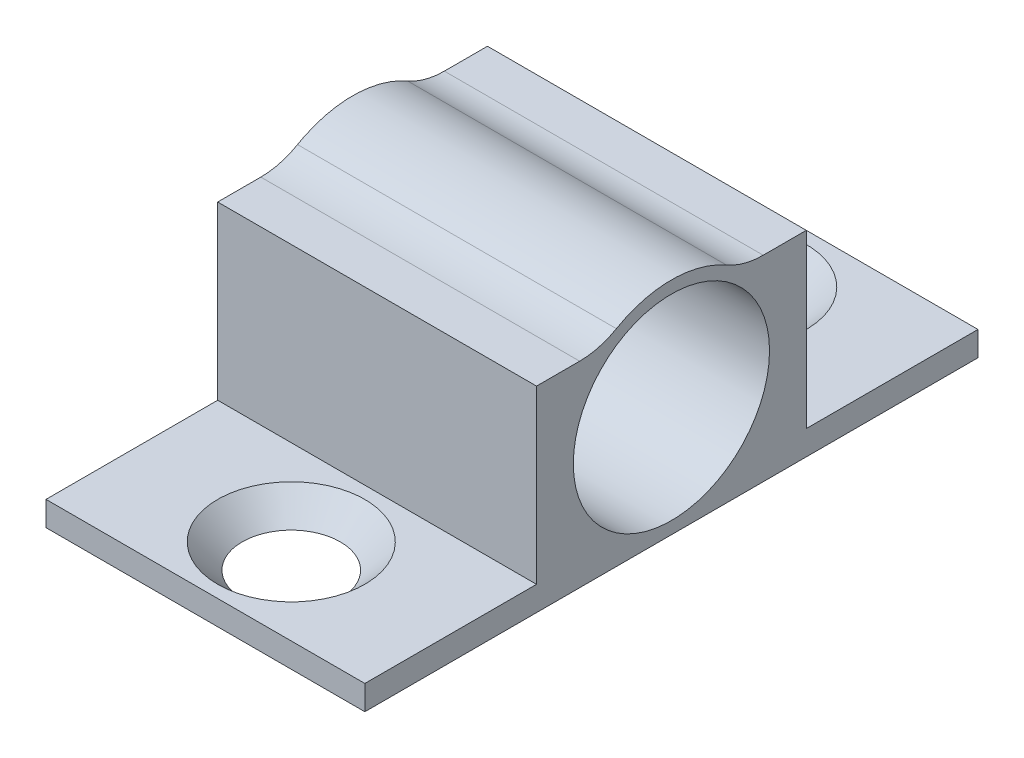
ISO-10303-21;
HEADER;
FILE_DESCRIPTION(('STEP AP214'),'2;1');
FILE_NAME('part.step','',(''),(''),'','','');
FILE_SCHEMA(('AUTOMOTIVE_DESIGN { 1 0 10303 214 1 1 1 1 }'));
ENDSEC;
DATA;
#1=APPLICATION_CONTEXT('core data for automotive mechanical design processes');
#2=APPLICATION_PROTOCOL_DEFINITION('international standard','automotive_design',2000,#1);
#3=PRODUCT_CONTEXT('',#1,'mechanical');
#4=PRODUCT('Part','Part','',(#3));
#5=PRODUCT_RELATED_PRODUCT_CATEGORY('part','',(#4));
#6=PRODUCT_DEFINITION_FORMATION('','',#4);
#7=PRODUCT_DEFINITION_CONTEXT('part definition',#1,'design');
#8=PRODUCT_DEFINITION('design','',#6,#7);
#9=PRODUCT_DEFINITION_SHAPE('','',#8);
#10=(LENGTH_UNIT() NAMED_UNIT(*) SI_UNIT(.MILLI.,.METRE.));
#11=(NAMED_UNIT(*) PLANE_ANGLE_UNIT() SI_UNIT($,.RADIAN.));
#12=(NAMED_UNIT(*) SI_UNIT($,.STERADIAN.) SOLID_ANGLE_UNIT());
#13=UNCERTAINTY_MEASURE_WITH_UNIT(LENGTH_MEASURE(1.E-05),#10,'distance_accuracy_value','');
#14=(GEOMETRIC_REPRESENTATION_CONTEXT(3) GLOBAL_UNCERTAINTY_ASSIGNED_CONTEXT((#13)) GLOBAL_UNIT_ASSIGNED_CONTEXT((#10,
#11,#12)) REPRESENTATION_CONTEXT('',''));
#15=CARTESIAN_POINT('',(0.,0.,0.));
#16=DIRECTION('',(0.,0.,1.));
#17=DIRECTION('',(1.,0.,0.));
#18=AXIS2_PLACEMENT_3D('',#15,#16,#17);
#19=CARTESIAN_POINT('',(0.,0.,0.));
#20=DIRECTION('',(0.,-1.,0.));
#21=DIRECTION('',(0.,0.,-1.));
#22=AXIS2_PLACEMENT_3D('',#19,#20,#21);
#23=PLANE('',#22);
#24=CARTESIAN_POINT('',(6.5,0.,-3.5));
#25=DIRECTION('',(0.,-1.,0.));
#26=DIRECTION('',(0.,0.,-1.));
#27=AXIS2_PLACEMENT_3D('',#24,#25,#26);
#28=CIRCLE('',#27,2.);
#29=CARTESIAN_POINT('',(6.5,0.,-5.5));
#30=VERTEX_POINT('',#29);
#31=EDGE_CURVE('E37',#30,#30,#28,.T.);
#32=ORIENTED_EDGE('',*,*,#31,.F.);
#33=EDGE_LOOP('',(#32));
#34=FACE_BOUND('',#33,.T.);
#35=DIRECTION('',(-1.,0.,0.));
#36=VECTOR('',#35,1.);
#37=CARTESIAN_POINT('',(0.,0.,-25.));
#38=LINE('',#37,#36);
#39=CARTESIAN_POINT('',(13.,0.,-25.));
#40=VERTEX_POINT('',#39);
#41=CARTESIAN_POINT('',(0.,0.,-25.));
#42=VERTEX_POINT('',#41);
#43=EDGE_CURVE('E194',#40,#42,#38,.T.);
#44=ORIENTED_EDGE('',*,*,#43,.F.);
#45=DIRECTION('',(0.,0.,-1.));
#46=VECTOR('',#45,1.);
#47=CARTESIAN_POINT('',(13.,0.,0.));
#48=LINE('',#47,#46);
#49=CARTESIAN_POINT('',(13.,0.,0.));
#50=VERTEX_POINT('',#49);
#51=EDGE_CURVE('E196',#50,#40,#48,.T.);
#52=ORIENTED_EDGE('',*,*,#51,.F.);
#53=DIRECTION('',(1.,0.,0.));
#54=VECTOR('',#53,1.);
#55=CARTESIAN_POINT('',(0.,0.,0.));
#56=LINE('',#55,#54);
#57=CARTESIAN_POINT('',(0.,0.,0.));
#58=VERTEX_POINT('',#57);
#59=EDGE_CURVE('E198',#58,#50,#56,.T.);
#60=ORIENTED_EDGE('',*,*,#59,.F.);
#61=DIRECTION('',(0.,0.,1.));
#62=VECTOR('',#61,1.);
#63=CARTESIAN_POINT('',(0.,0.,0.));
#64=LINE('',#63,#62);
#65=CARTESIAN_POINT('',(0.,0.,-12.5));
#66=VERTEX_POINT('',#65);
#67=EDGE_CURVE('E148',#66,#58,#64,.T.);
#68=ORIENTED_EDGE('',*,*,#67,.F.);
#69=EDGE_CURVE('E150',#42,#66,#64,.T.);
#70=ORIENTED_EDGE('',*,*,#69,.F.);
#71=EDGE_LOOP('',(#44,#52,#60,#68,#70));
#72=FACE_BOUND('',#71,.T.);
#73=CARTESIAN_POINT('',(6.5,0.,-21.5));
#74=DIRECTION('',(0.,-1.,0.));
#75=DIRECTION('',(0.,0.,-1.));
#76=AXIS2_PLACEMENT_3D('',#73,#74,#75);
#77=CIRCLE('',#76,2.);
#78=CARTESIAN_POINT('',(6.5,0.,-23.5));
#79=VERTEX_POINT('',#78);
#80=EDGE_CURVE('E239',#79,#79,#77,.T.);
#81=ORIENTED_EDGE('',*,*,#80,.F.);
#82=EDGE_LOOP('',(#81));
#83=FACE_BOUND('',#82,.T.);
#84=ADVANCED_FACE('F33',(#34,#72,#83),#23,.T.);
#85=CARTESIAN_POINT('',(0.,1.,0.));
#86=DIRECTION('',(1.,0.,0.));
#87=DIRECTION('',(0.,0.,-1.));
#88=AXIS2_PLACEMENT_3D('',#85,#86,#87);
#89=PLANE('',#88);
#90=DIRECTION('',(0.,0.,1.));
#91=VECTOR('',#90,1.);
#92=CARTESIAN_POINT('',(0.,8.,-18.));
#93=LINE('',#92,#91);
#94=CARTESIAN_POINT('',(0.,8.,-8.75834261322606));
#95=VERTEX_POINT('',#94);
#96=CARTESIAN_POINT('',(0.,8.,-7.));
#97=VERTEX_POINT('',#96);
#98=EDGE_CURVE('E124',#95,#97,#93,.T.);
#99=ORIENTED_EDGE('',*,*,#98,.F.);
#100=CARTESIAN_POINT('',(0.,11.,-8.75834261322606));
#101=DIRECTION('',(1.,0.,0.));
#102=DIRECTION('',(0.,0.,-1.));
#103=AXIS2_PLACEMENT_3D('',#100,#101,#102);
#104=CIRCLE('',#103,3.);
#105=CARTESIAN_POINT('',(0.,8.4,-10.2550055679356));
#106=VERTEX_POINT('',#105);
#107=EDGE_CURVE('E11',#95,#106,#104,.T.);
#108=ORIENTED_EDGE('',*,*,#107,.T.);
#109=CARTESIAN_POINT('',(0.,4.5,-12.5));
#110=DIRECTION('',(1.,0.,0.));
#111=DIRECTION('',(0.,0.,-1.));
#112=AXIS2_PLACEMENT_3D('',#109,#110,#111);
#113=CIRCLE('',#112,4.5);
#114=EDGE_CURVE('E227',#106,#66,#113,.T.);
#115=ORIENTED_EDGE('',*,*,#114,.T.);
#116=ORIENTED_EDGE('',*,*,#67,.T.);
#117=DIRECTION('',(0.,-1.,0.));
#118=VECTOR('',#117,1.);
#119=CARTESIAN_POINT('',(0.,1.,0.));
#120=LINE('',#119,#118);
#121=CARTESIAN_POINT('',(0.,1.,0.));
#122=VERTEX_POINT('',#121);
#123=EDGE_CURVE('E180',#122,#58,#120,.T.);
#124=ORIENTED_EDGE('',*,*,#123,.F.);
#125=DIRECTION('',(0.,0.,1.));
#126=VECTOR('',#125,1.);
#127=CARTESIAN_POINT('',(0.,1.,0.));
#128=LINE('',#127,#126);
#129=CARTESIAN_POINT('',(0.,1.,-7.));
#130=VERTEX_POINT('',#129);
#131=EDGE_CURVE('E147',#130,#122,#128,.T.);
#132=ORIENTED_EDGE('',*,*,#131,.F.);
#133=DIRECTION('',(0.,-1.,0.));
#134=VECTOR('',#133,1.);
#135=CARTESIAN_POINT('',(0.,8.,-7.));
#136=LINE('',#135,#134);
#137=EDGE_CURVE('E139',#97,#130,#136,.T.);
#138=ORIENTED_EDGE('',*,*,#137,.F.);
#139=EDGE_LOOP('',(#99,#108,#115,#116,#124,#132,#138));
#140=FACE_BOUND('',#139,.T.);
#141=ADVANCED_FACE('F145',(#140),#89,.F.);
#142=CARTESIAN_POINT('',(0.,8.,0.));
#143=DIRECTION('',(0.,1.,0.));
#144=DIRECTION('',(0.,0.,1.));
#145=AXIS2_PLACEMENT_3D('',#142,#143,#144);
#146=PLANE('',#145);
#147=DIRECTION('',(0.,0.,-1.));
#148=VECTOR('',#147,1.);
#149=CARTESIAN_POINT('',(13.,8.,-18.));
#150=LINE('',#149,#148);
#151=CARTESIAN_POINT('',(13.,8.,-7.));
#152=VERTEX_POINT('',#151);
#153=CARTESIAN_POINT('',(13.,8.,-8.75834261322606));
#154=VERTEX_POINT('',#153);
#155=EDGE_CURVE('E220',#152,#154,#150,.T.);
#156=ORIENTED_EDGE('',*,*,#155,.T.);
#157=DIRECTION('',(-1.,0.,0.));
#158=VECTOR('',#157,1.);
#159=CARTESIAN_POINT('',(0.,8.,-8.75834261322606));
#160=LINE('',#159,#158);
#161=EDGE_CURVE('E56',#154,#95,#160,.T.);
#162=ORIENTED_EDGE('',*,*,#161,.T.);
#163=ORIENTED_EDGE('',*,*,#98,.T.);
#164=DIRECTION('',(1.,0.,0.));
#165=VECTOR('',#164,1.);
#166=CARTESIAN_POINT('',(0.,8.,-7.));
#167=LINE('',#166,#165);
#168=EDGE_CURVE('E127',#97,#152,#167,.T.);
#169=ORIENTED_EDGE('',*,*,#168,.T.);
#170=EDGE_LOOP('',(#156,#162,#163,#169));
#171=FACE_BOUND('',#170,.T.);
#172=ADVANCED_FACE('F126',(#171),#146,.T.);
#173=CARTESIAN_POINT('',(0.,1.,0.));
#174=DIRECTION('',(0.,-1.,0.));
#175=DIRECTION('',(0.,0.,-1.));
#176=AXIS2_PLACEMENT_3D('',#173,#174,#175);
#177=PLANE('',#176);
#178=CARTESIAN_POINT('',(6.5,1.,-21.5));
#179=DIRECTION('',(0.,1.,0.));
#180=DIRECTION('',(0.,0.,1.));
#181=AXIS2_PLACEMENT_3D('',#178,#179,#180);
#182=CIRCLE('',#181,3.);
#183=CARTESIAN_POINT('',(6.5,1.,-18.5));
#184=VERTEX_POINT('',#183);
#185=EDGE_CURVE('E240',#184,#184,#182,.T.);
#186=ORIENTED_EDGE('',*,*,#185,.F.);
#187=EDGE_LOOP('',(#186));
#188=FACE_BOUND('',#187,.T.);
#189=DIRECTION('',(-1.,0.,0.));
#190=VECTOR('',#189,1.);
#191=CARTESIAN_POINT('',(0.,1.,-18.));
#192=LINE('',#191,#190);
#193=CARTESIAN_POINT('',(13.,1.,-18.));
#194=VERTEX_POINT('',#193);
#195=CARTESIAN_POINT('',(0.,1.,-18.));
#196=VERTEX_POINT('',#195);
#197=EDGE_CURVE('E133',#194,#196,#192,.T.);
#198=ORIENTED_EDGE('',*,*,#197,.F.);
#199=DIRECTION('',(0.,0.,-1.));
#200=VECTOR('',#199,1.);
#201=CARTESIAN_POINT('',(13.,1.,0.));
#202=LINE('',#201,#200);
#203=CARTESIAN_POINT('',(13.,1.,-25.));
#204=VERTEX_POINT('',#203);
#205=EDGE_CURVE('E205',#194,#204,#202,.T.);
#206=ORIENTED_EDGE('',*,*,#205,.T.);
#207=DIRECTION('',(-1.,0.,0.));
#208=VECTOR('',#207,1.);
#209=CARTESIAN_POINT('',(0.,1.,-25.));
#210=LINE('',#209,#208);
#211=CARTESIAN_POINT('',(0.,1.,-25.));
#212=VERTEX_POINT('',#211);
#213=EDGE_CURVE('E193',#204,#212,#210,.T.);
#214=ORIENTED_EDGE('',*,*,#213,.T.);
#215=EDGE_CURVE('E178',#212,#196,#128,.T.);
#216=ORIENTED_EDGE('',*,*,#215,.T.);
#217=EDGE_LOOP('',(#198,#206,#214,#216));
#218=FACE_BOUND('',#217,.T.);
#219=ADVANCED_FACE('F289',(#188,#218),#177,.F.);
#220=CARTESIAN_POINT('',(6.5,1.,-3.5));
#221=DIRECTION('',(0.,1.,0.));
#222=DIRECTION('',(0.,0.,1.));
#223=AXIS2_PLACEMENT_3D('',#220,#221,#222);
#224=CIRCLE('',#223,3.);
#225=CARTESIAN_POINT('',(6.5,1.,-0.500000000000001));
#226=VERTEX_POINT('',#225);
#227=EDGE_CURVE('E243',#226,#226,#224,.T.);
#228=ORIENTED_EDGE('',*,*,#227,.F.);
#229=EDGE_LOOP('',(#228));
#230=FACE_BOUND('',#229,.T.);
#231=DIRECTION('',(1.,0.,0.));
#232=VECTOR('',#231,1.);
#233=CARTESIAN_POINT('',(0.,1.,-7.));
#234=LINE('',#233,#232);
#235=CARTESIAN_POINT('',(13.,1.,-7.));
#236=VERTEX_POINT('',#235);
#237=EDGE_CURVE('E162',#130,#236,#234,.T.);
#238=ORIENTED_EDGE('',*,*,#237,.F.);
#239=ORIENTED_EDGE('',*,*,#131,.T.);
#240=DIRECTION('',(1.,0.,0.));
#241=VECTOR('',#240,1.);
#242=CARTESIAN_POINT('',(0.,1.,0.));
#243=LINE('',#242,#241);
#244=CARTESIAN_POINT('',(13.,1.,0.));
#245=VERTEX_POINT('',#244);
#246=EDGE_CURVE('E172',#122,#245,#243,.T.);
#247=ORIENTED_EDGE('',*,*,#246,.T.);
#248=EDGE_CURVE('E201',#245,#236,#202,.T.);
#249=ORIENTED_EDGE('',*,*,#248,.T.);
#250=EDGE_LOOP('',(#238,#239,#247,#249));
#251=FACE_BOUND('',#250,.T.);
#252=ADVANCED_FACE('F214',(#230,#251),#177,.F.);
#253=ORIENTED_EDGE('',*,*,#69,.T.);
#254=CARTESIAN_POINT('',(0.,8.4,-14.7449944320644));
#255=VERTEX_POINT('',#254);
#256=EDGE_CURVE('E225',#66,#255,#113,.T.);
#257=ORIENTED_EDGE('',*,*,#256,.T.);
#258=CARTESIAN_POINT('',(0.,11.,-16.2416573867739));
#259=DIRECTION('',(1.,0.,0.));
#260=DIRECTION('',(0.,0.,-1.));
#261=AXIS2_PLACEMENT_3D('',#258,#259,#260);
#262=CIRCLE('',#261,3.);
#263=CARTESIAN_POINT('',(0.,8.,-16.2416573867739));
#264=VERTEX_POINT('',#263);
#265=EDGE_CURVE('E265',#255,#264,#262,.T.);
#266=ORIENTED_EDGE('',*,*,#265,.T.);
#267=CARTESIAN_POINT('',(0.,8.,-18.));
#268=VERTEX_POINT('',#267);
#269=EDGE_CURVE('E132',#268,#264,#93,.T.);
#270=ORIENTED_EDGE('',*,*,#269,.F.);
#271=DIRECTION('',(0.,-1.,0.));
#272=VECTOR('',#271,1.);
#273=CARTESIAN_POINT('',(0.,8.,-18.));
#274=LINE('',#273,#272);
#275=EDGE_CURVE('E163',#268,#196,#274,.T.);
#276=ORIENTED_EDGE('',*,*,#275,.T.);
#277=ORIENTED_EDGE('',*,*,#215,.F.);
#278=DIRECTION('',(0.,-1.,0.));
#279=VECTOR('',#278,1.);
#280=CARTESIAN_POINT('',(0.,1.,-25.));
#281=LINE('',#280,#279);
#282=EDGE_CURVE('E190',#212,#42,#281,.T.);
#283=ORIENTED_EDGE('',*,*,#282,.T.);
#284=EDGE_LOOP('',(#253,#257,#266,#270,#276,#277,#283));
#285=FACE_BOUND('',#284,.T.);
#286=ADVANCED_FACE('F287',(#285),#89,.F.);
#287=CARTESIAN_POINT('',(0.,1.,0.));
#288=DIRECTION('',(0.,0.,-1.));
#289=DIRECTION('',(-1.,0.,0.));
#290=AXIS2_PLACEMENT_3D('',#287,#288,#289);
#291=PLANE('',#290);
#292=ORIENTED_EDGE('',*,*,#59,.T.);
#293=DIRECTION('',(0.,-1.,0.));
#294=VECTOR('',#293,1.);
#295=CARTESIAN_POINT('',(13.,1.,0.));
#296=LINE('',#295,#294);
#297=EDGE_CURVE('E184',#245,#50,#296,.T.);
#298=ORIENTED_EDGE('',*,*,#297,.F.);
#299=ORIENTED_EDGE('',*,*,#246,.F.);
#300=ORIENTED_EDGE('',*,*,#123,.T.);
#301=EDGE_LOOP('',(#292,#298,#299,#300));
#302=FACE_BOUND('',#301,.T.);
#303=ADVANCED_FACE('F216',(#302),#291,.F.);
#304=CARTESIAN_POINT('',(13.,1.,0.));
#305=DIRECTION('',(-1.,0.,0.));
#306=DIRECTION('',(0.,0.,1.));
#307=AXIS2_PLACEMENT_3D('',#304,#305,#306);
#308=PLANE('',#307);
#309=CARTESIAN_POINT('',(13.,4.5,-12.5));
#310=DIRECTION('',(-1.,0.,0.));
#311=DIRECTION('',(0.,0.,1.));
#312=AXIS2_PLACEMENT_3D('',#309,#310,#311);
#313=CIRCLE('',#312,4.);
#314=CARTESIAN_POINT('',(13.,4.5,-8.5));
#315=VERTEX_POINT('',#314);
#316=EDGE_CURVE('E231',#315,#315,#313,.T.);
#317=ORIENTED_EDGE('',*,*,#316,.T.);
#318=EDGE_LOOP('',(#317));
#319=FACE_BOUND('',#318,.T.);
#320=ORIENTED_EDGE('',*,*,#51,.T.);
#321=DIRECTION('',(0.,-1.,0.));
#322=VECTOR('',#321,1.);
#323=CARTESIAN_POINT('',(13.,1.,-25.));
#324=LINE('',#323,#322);
#325=EDGE_CURVE('E187',#204,#40,#324,.T.);
#326=ORIENTED_EDGE('',*,*,#325,.F.);
#327=ORIENTED_EDGE('',*,*,#205,.F.);
#328=DIRECTION('',(0.,-1.,0.));
#329=VECTOR('',#328,1.);
#330=CARTESIAN_POINT('',(13.,8.,-18.));
#331=LINE('',#330,#329);
#332=CARTESIAN_POINT('',(13.,8.,-18.));
#333=VERTEX_POINT('',#332);
#334=EDGE_CURVE('E152',#333,#194,#331,.T.);
#335=ORIENTED_EDGE('',*,*,#334,.F.);
#336=CARTESIAN_POINT('',(13.,8.,-16.2416573867739));
#337=VERTEX_POINT('',#336);
#338=EDGE_CURVE('E142',#337,#333,#150,.T.);
#339=ORIENTED_EDGE('',*,*,#338,.F.);
#340=CARTESIAN_POINT('',(13.,11.,-16.2416573867739));
#341=DIRECTION('',(-1.,0.,0.));
#342=DIRECTION('',(0.,0.,1.));
#343=AXIS2_PLACEMENT_3D('',#340,#341,#342);
#344=CIRCLE('',#343,3.);
#345=CARTESIAN_POINT('',(13.,8.4,-14.7449944320644));
#346=VERTEX_POINT('',#345);
#347=EDGE_CURVE('E263',#337,#346,#344,.T.);
#348=ORIENTED_EDGE('',*,*,#347,.T.);
#349=CARTESIAN_POINT('',(13.,4.5,-12.5));
#350=DIRECTION('',(1.,0.,0.));
#351=DIRECTION('',(0.,0.,-1.));
#352=AXIS2_PLACEMENT_3D('',#349,#350,#351);
#353=CIRCLE('',#352,4.5);
#354=CARTESIAN_POINT('',(13.,8.4,-10.2550055679356));
#355=VERTEX_POINT('',#354);
#356=EDGE_CURVE('E229',#346,#355,#353,.T.);
#357=ORIENTED_EDGE('',*,*,#356,.T.);
#358=CARTESIAN_POINT('',(13.,11.,-8.75834261322606));
#359=DIRECTION('',(-1.,0.,0.));
#360=DIRECTION('',(0.,0.,1.));
#361=AXIS2_PLACEMENT_3D('',#358,#359,#360);
#362=CIRCLE('',#361,3.);
#363=EDGE_CURVE('E42',#355,#154,#362,.T.);
#364=ORIENTED_EDGE('',*,*,#363,.T.);
#365=ORIENTED_EDGE('',*,*,#155,.F.);
#366=DIRECTION('',(0.,-1.,0.));
#367=VECTOR('',#366,1.);
#368=CARTESIAN_POINT('',(13.,8.,-7.));
#369=LINE('',#368,#367);
#370=EDGE_CURVE('E141',#152,#236,#369,.T.);
#371=ORIENTED_EDGE('',*,*,#370,.T.);
#372=ORIENTED_EDGE('',*,*,#248,.F.);
#373=ORIENTED_EDGE('',*,*,#297,.T.);
#374=EDGE_LOOP('',(#320,#326,#327,#335,#339,#348,#357,#364,#365,#371,#372,#373));
#375=FACE_BOUND('',#374,.T.);
#376=ADVANCED_FACE('F219',(#319,#375),#308,.F.);
#377=CARTESIAN_POINT('',(0.,1.,-25.));
#378=DIRECTION('',(0.,0.,1.));
#379=DIRECTION('',(1.,0.,0.));
#380=AXIS2_PLACEMENT_3D('',#377,#378,#379);
#381=PLANE('',#380);
#382=ORIENTED_EDGE('',*,*,#43,.T.);
#383=ORIENTED_EDGE('',*,*,#282,.F.);
#384=ORIENTED_EDGE('',*,*,#213,.F.);
#385=ORIENTED_EDGE('',*,*,#325,.T.);
#386=EDGE_LOOP('',(#382,#383,#384,#385));
#387=FACE_BOUND('',#386,.T.);
#388=ADVANCED_FACE('F294',(#387),#381,.F.);
#389=CARTESIAN_POINT('',(0.,8.,-7.));
#390=DIRECTION('',(0.,0.,-1.));
#391=DIRECTION('',(-1.,0.,0.));
#392=AXIS2_PLACEMENT_3D('',#389,#390,#391);
#393=PLANE('',#392);
#394=ORIENTED_EDGE('',*,*,#237,.T.);
#395=ORIENTED_EDGE('',*,*,#370,.F.);
#396=ORIENTED_EDGE('',*,*,#168,.F.);
#397=ORIENTED_EDGE('',*,*,#137,.T.);
#398=EDGE_LOOP('',(#394,#395,#396,#397));
#399=FACE_BOUND('',#398,.T.);
#400=ADVANCED_FACE('F138',(#399),#393,.F.);
#401=CARTESIAN_POINT('',(0.,8.,-18.));
#402=DIRECTION('',(0.,0.,1.));
#403=DIRECTION('',(1.,0.,0.));
#404=AXIS2_PLACEMENT_3D('',#401,#402,#403);
#405=PLANE('',#404);
#406=ORIENTED_EDGE('',*,*,#197,.T.);
#407=ORIENTED_EDGE('',*,*,#275,.F.);
#408=DIRECTION('',(-1.,0.,0.));
#409=VECTOR('',#408,1.);
#410=CARTESIAN_POINT('',(0.,8.,-18.));
#411=LINE('',#410,#409);
#412=EDGE_CURVE('E221',#333,#268,#411,.T.);
#413=ORIENTED_EDGE('',*,*,#412,.F.);
#414=ORIENTED_EDGE('',*,*,#334,.T.);
#415=EDGE_LOOP('',(#406,#407,#413,#414));
#416=FACE_BOUND('',#415,.T.);
#417=ADVANCED_FACE('F288',(#416),#405,.F.);
#418=ORIENTED_EDGE('',*,*,#269,.T.);
#419=DIRECTION('',(-1.,0.,0.));
#420=VECTOR('',#419,1.);
#421=CARTESIAN_POINT('',(13.,8.,-16.2416573867739));
#422=LINE('',#421,#420);
#423=EDGE_CURVE('E268',#264,#337,#422,.F.);
#424=ORIENTED_EDGE('',*,*,#423,.T.);
#425=ORIENTED_EDGE('',*,*,#338,.T.);
#426=ORIENTED_EDGE('',*,*,#412,.T.);
#427=EDGE_LOOP('',(#418,#424,#425,#426));
#428=FACE_BOUND('',#427,.T.);
#429=ADVANCED_FACE('F308',(#428),#146,.T.);
#430=CARTESIAN_POINT('',(-4.99999999997031E-05,4.5,-12.5));
#431=DIRECTION('',(1.,0.,0.));
#432=DIRECTION('',(0.,0.,-1.));
#433=AXIS2_PLACEMENT_3D('',#430,#431,#432);
#434=CYLINDRICAL_SURFACE('',#433,4.5);
#435=CARTESIAN_POINT('',(-4.99999999997031E-05,4.5,-12.5));
#436=DIRECTION('',(1.,0.,0.));
#437=DIRECTION('',(0.,0.,-1.));
#438=AXIS2_PLACEMENT_3D('',#435,#436,#437);
#439=CIRCLE('',#438,4.5);
#440=CARTESIAN_POINT('',(-4.99999999997031E-05,4.5,-17.));
#441=VERTEX_POINT('',#440);
#442=EDGE_CURVE('E228',#441,#441,#439,.T.);
#443=ORIENTED_EDGE('',*,*,#442,.T.);
#444=EDGE_LOOP('',(#443));
#445=FACE_BOUND('',#444,.T.);
#446=ORIENTED_EDGE('',*,*,#356,.F.);
#447=DIRECTION('',(1.,0.,0.));
#448=VECTOR('',#447,1.);
#449=CARTESIAN_POINT('',(-4.99999999997031E-05,8.4,-14.7449944320644));
#450=LINE('',#449,#448);
#451=EDGE_CURVE('E270',#346,#255,#450,.F.);
#452=ORIENTED_EDGE('',*,*,#451,.T.);
#453=ORIENTED_EDGE('',*,*,#256,.F.);
#454=ORIENTED_EDGE('',*,*,#114,.F.);
#455=DIRECTION('',(1.,0.,0.));
#456=VECTOR('',#455,1.);
#457=CARTESIAN_POINT('',(-4.99999999997031E-05,8.4,-10.2550055679356));
#458=LINE('',#457,#456);
#459=EDGE_CURVE('E183',#106,#355,#458,.T.);
#460=ORIENTED_EDGE('',*,*,#459,.T.);
#461=EDGE_LOOP('',(#446,#452,#453,#454,#460));
#462=FACE_BOUND('',#461,.T.);
#463=ADVANCED_FACE('F300',(#445,#462),#434,.T.);
#464=CARTESIAN_POINT('',(-4.99999999997031E-05,4.5,-12.5));
#465=DIRECTION('',(1.,0.,0.));
#466=DIRECTION('',(0.,0.,-1.));
#467=AXIS2_PLACEMENT_3D('',#464,#465,#466);
#468=PLANE('',#467);
#469=CARTESIAN_POINT('',(-4.99999999997031E-05,4.5,-12.5));
#470=DIRECTION('',(-1.,0.,0.));
#471=DIRECTION('',(0.,0.,1.));
#472=AXIS2_PLACEMENT_3D('',#469,#470,#471);
#473=CIRCLE('',#472,4.);
#474=CARTESIAN_POINT('',(-4.99999999979683E-05,4.5,-8.5));
#475=VERTEX_POINT('',#474);
#476=EDGE_CURVE('E236',#475,#475,#473,.T.);
#477=ORIENTED_EDGE('',*,*,#476,.F.);
#478=EDGE_LOOP('',(#477));
#479=FACE_BOUND('',#478,.T.);
#480=ORIENTED_EDGE('',*,*,#442,.F.);
#481=EDGE_LOOP('',(#480));
#482=FACE_BOUND('',#481,.T.);
#483=ADVANCED_FACE('F315',(#479,#482),#468,.F.);
#484=CARTESIAN_POINT('',(13.00005,4.5,-12.5));
#485=DIRECTION('',(-1.,0.,0.));
#486=DIRECTION('',(0.,0.,1.));
#487=AXIS2_PLACEMENT_3D('',#484,#485,#486);
#488=CYLINDRICAL_SURFACE('',#487,4.);
#489=CARTESIAN_POINT('',(-4.99999999979683E-05,4.5,-8.5));
#490=CARTESIAN_POINT('',(0.135367187500002,4.5,-8.5));
#491=CARTESIAN_POINT('',(0.270784375000002,4.5,-8.5));
#492=CARTESIAN_POINT('',(0.541618750000001,4.5,-8.5));
#493=CARTESIAN_POINT('',(0.677035937500001,4.5,-8.5));
#494=CARTESIAN_POINT('',(0.947870312500002,4.5,-8.5));
#495=CARTESIAN_POINT('',(1.0832875,4.5,-8.5));
#496=CARTESIAN_POINT('',(1.354121875,4.5,-8.5));
#497=CARTESIAN_POINT('',(1.4895390625,4.5,-8.5));
#498=CARTESIAN_POINT('',(1.7603734375,4.5,-8.5));
#499=CARTESIAN_POINT('',(1.895790625,4.5,-8.5));
#500=CARTESIAN_POINT('',(2.166625,4.5,-8.5));
#501=CARTESIAN_POINT('',(2.3020421875,4.5,-8.5));
#502=CARTESIAN_POINT('',(2.5728765625,4.5,-8.5));
#503=CARTESIAN_POINT('',(2.70829375,4.5,-8.5));
#504=CARTESIAN_POINT('',(2.979128125,4.5,-8.5));
#505=CARTESIAN_POINT('',(3.1145453125,4.5,-8.5));
#506=CARTESIAN_POINT('',(3.3853796875,4.5,-8.5));
#507=CARTESIAN_POINT('',(3.520796875,4.5,-8.5));
#508=CARTESIAN_POINT('',(3.79163125,4.5,-8.5));
#509=CARTESIAN_POINT('',(3.9270484375,4.5,-8.5));
#510=CARTESIAN_POINT('',(4.1978828125,4.5,-8.5));
#511=CARTESIAN_POINT('',(4.3333,4.5,-8.5));
#512=CARTESIAN_POINT('',(4.604134375,4.5,-8.5));
#513=CARTESIAN_POINT('',(4.7395515625,4.5,-8.5));
#514=CARTESIAN_POINT('',(5.0103859375,4.5,-8.5));
#515=CARTESIAN_POINT('',(5.145803125,4.5,-8.5));
#516=CARTESIAN_POINT('',(5.4166375,4.5,-8.5));
#517=CARTESIAN_POINT('',(5.5520546875,4.5,-8.5));
#518=CARTESIAN_POINT('',(5.8228890625,4.5,-8.5));
#519=CARTESIAN_POINT('',(5.95830625,4.5,-8.5));
#520=CARTESIAN_POINT('',(6.229140625,4.5,-8.5));
#521=CARTESIAN_POINT('',(6.3645578125,4.5,-8.5));
#522=CARTESIAN_POINT('',(6.6353921875,4.5,-8.5));
#523=CARTESIAN_POINT('',(6.770809375,4.5,-8.5));
#524=CARTESIAN_POINT('',(7.04164375,4.5,-8.5));
#525=CARTESIAN_POINT('',(7.1770609375,4.5,-8.5));
#526=CARTESIAN_POINT('',(7.4478953125,4.5,-8.5));
#527=CARTESIAN_POINT('',(7.5833125,4.5,-8.5));
#528=CARTESIAN_POINT('',(7.854146875,4.5,-8.5));
#529=CARTESIAN_POINT('',(7.9895640625,4.5,-8.5));
#530=CARTESIAN_POINT('',(8.2603984375,4.5,-8.5));
#531=CARTESIAN_POINT('',(8.395815625,4.5,-8.5));
#532=CARTESIAN_POINT('',(8.66665,4.5,-8.5));
#533=CARTESIAN_POINT('',(8.8020671875,4.5,-8.5));
#534=CARTESIAN_POINT('',(9.0729015625,4.5,-8.5));
#535=CARTESIAN_POINT('',(9.20831875,4.5,-8.5));
#536=CARTESIAN_POINT('',(9.479153125,4.5,-8.5));
#537=CARTESIAN_POINT('',(9.6145703125,4.5,-8.5));
#538=CARTESIAN_POINT('',(9.8854046875,4.5,-8.5));
#539=CARTESIAN_POINT('',(10.020821875,4.5,-8.5));
#540=CARTESIAN_POINT('',(10.29165625,4.5,-8.5));
#541=CARTESIAN_POINT('',(10.4270734375,4.5,-8.5));
#542=CARTESIAN_POINT('',(10.6979078125,4.5,-8.5));
#543=CARTESIAN_POINT('',(10.833325,4.5,-8.5));
#544=CARTESIAN_POINT('',(11.104159375,4.5,-8.5));
#545=CARTESIAN_POINT('',(11.2395765625,4.5,-8.5));
#546=CARTESIAN_POINT('',(11.5104109375,4.5,-8.5));
#547=CARTESIAN_POINT('',(11.645828125,4.5,-8.5));
#548=CARTESIAN_POINT('',(11.9166625,4.5,-8.5));
#549=CARTESIAN_POINT('',(12.0520796875,4.5,-8.5));
#550=CARTESIAN_POINT('',(12.3229140625,4.5,-8.5));
#551=CARTESIAN_POINT('',(12.45833125,4.5,-8.5));
#552=CARTESIAN_POINT('',(12.729165625,4.5,-8.5));
#553=CARTESIAN_POINT('',(12.8645828125,4.5,-8.5));
#554=CARTESIAN_POINT('',(13.,4.5,-8.5));
#555=B_SPLINE_CURVE_WITH_KNOTS('',3,(#489,#490,#491,#492,#493,#494,#495,#496,#497,#498,#499,
#500,#501,#502,#503,#504,#505,#506,#507,#508,#509,#510,#511,#512,#513,#514,#515,#516,#517,#518,
#519,#520,#521,#522,#523,#524,#525,#526,#527,#528,#529,#530,#531,#532,#533,#534,#535,#536,#537,
#538,#539,#540,#541,#542,#543,#544,#545,#546,#547,#548,#549,#550,#551,#552,#553,#554),
.UNSPECIFIED.,.F.,.F.,(4,2,2,2,2,2,2,2,2,2,2,2,2,2,2,2,2,2,2,2,2,2,2,2,2,2,2,2,2,2,2,2,4),(0.,
0.4062515625,0.812503124999999,1.2187546875,1.62500625,2.0312578125,2.437509375,2.8437609375,
3.2500125,3.6562640625,4.062515625,4.4687671875,4.87501875,5.2812703125,5.687521875,
6.0937734375,6.500025,6.9062765625,7.312528125,7.7187796875,8.12503125,8.5312828125,8.937534375,
9.3437859375,9.7500375,10.1562890625,10.562540625,10.9687921875,11.37504375,11.7812953125,
12.187546875,12.5937984375,13.00005),.UNSPECIFIED.);
#556=EDGE_CURVE('BSEAM348',#475,#315,#555,.T.);
#557=ORIENTED_EDGE('',*,*,#476,.T.);
#558=ORIENTED_EDGE('',*,*,#316,.F.);
#559=ORIENTED_EDGE('',*,*,#556,.T.);
#560=ORIENTED_EDGE('',*,*,#556,.F.);
#561=EDGE_LOOP('',(#557,#559,#558,#560));
#562=FACE_BOUND('',#561,.T.);
#563=ADVANCED_FACE('F348',(#562),#488,.F.);
#564=CARTESIAN_POINT('',(-4.99999999997031E-05,11.,-16.2416573867739));
#565=DIRECTION('',(1.,0.,0.));
#566=DIRECTION('',(0.,0.,-1.));
#567=AXIS2_PLACEMENT_3D('',#564,#565,#566);
#568=CYLINDRICAL_SURFACE('',#567,3.);
#569=ORIENTED_EDGE('',*,*,#347,.F.);
#570=ORIENTED_EDGE('',*,*,#423,.F.);
#571=ORIENTED_EDGE('',*,*,#265,.F.);
#572=ORIENTED_EDGE('',*,*,#451,.F.);
#573=EDGE_LOOP('',(#569,#570,#571,#572));
#574=FACE_BOUND('',#573,.T.);
#575=ADVANCED_FACE('F306',(#574),#568,.F.);
#576=CARTESIAN_POINT('',(-4.99999999997031E-05,11.,-8.75834261322606));
#577=DIRECTION('',(1.,0.,0.));
#578=DIRECTION('',(0.,0.,-1.));
#579=AXIS2_PLACEMENT_3D('',#576,#577,#578);
#580=CYLINDRICAL_SURFACE('',#579,3.);
#581=ORIENTED_EDGE('',*,*,#107,.F.);
#582=ORIENTED_EDGE('',*,*,#161,.F.);
#583=ORIENTED_EDGE('',*,*,#363,.F.);
#584=ORIENTED_EDGE('',*,*,#459,.F.);
#585=EDGE_LOOP('',(#581,#582,#583,#584));
#586=FACE_BOUND('',#585,.T.);
#587=ADVANCED_FACE('F35',(#586),#580,.F.);
#588=CARTESIAN_POINT('',(6.5,1.,-21.5));
#589=DIRECTION('',(0.,1.,0.));
#590=DIRECTION('',(0.,0.,1.));
#591=AXIS2_PLACEMENT_3D('',#588,#589,#590);
#592=CONICAL_SURFACE('',#591,3.,0.785398163397448);
#593=ORIENTED_EDGE('',*,*,#80,.T.);
#594=EDGE_LOOP('',(#593));
#595=FACE_BOUND('',#594,.T.);
#596=ORIENTED_EDGE('',*,*,#185,.T.);
#597=EDGE_LOOP('',(#596));
#598=FACE_BOUND('',#597,.T.);
#599=ADVANCED_FACE('F359',(#595,#598),#592,.F.);
#600=CARTESIAN_POINT('',(6.5,1.,-3.5));
#601=DIRECTION('',(0.,1.,0.));
#602=DIRECTION('',(0.,0.,1.));
#603=AXIS2_PLACEMENT_3D('',#600,#601,#602);
#604=CONICAL_SURFACE('',#603,3.,0.785398163397448);
#605=ORIENTED_EDGE('',*,*,#31,.T.);
#606=EDGE_LOOP('',(#605));
#607=FACE_BOUND('',#606,.T.);
#608=ORIENTED_EDGE('',*,*,#227,.T.);
#609=EDGE_LOOP('',(#608));
#610=FACE_BOUND('',#609,.T.);
#611=ADVANCED_FACE('F250',(#607,#610),#604,.F.);
#612=CLOSED_SHELL('',(#84,#141,#172,#219,#252,#286,#303,#376,#388,#400,#417,#429,#463,#483,#563,
#575,#587,#599,#611));
#613=MANIFOLD_SOLID_BREP('B2',#612);
#614=ADVANCED_BREP_SHAPE_REPRESENTATION('',(#18,#613),#14);
#615=SHAPE_DEFINITION_REPRESENTATION(#9,#614);
ENDSEC;
END-ISO-10303-21;
